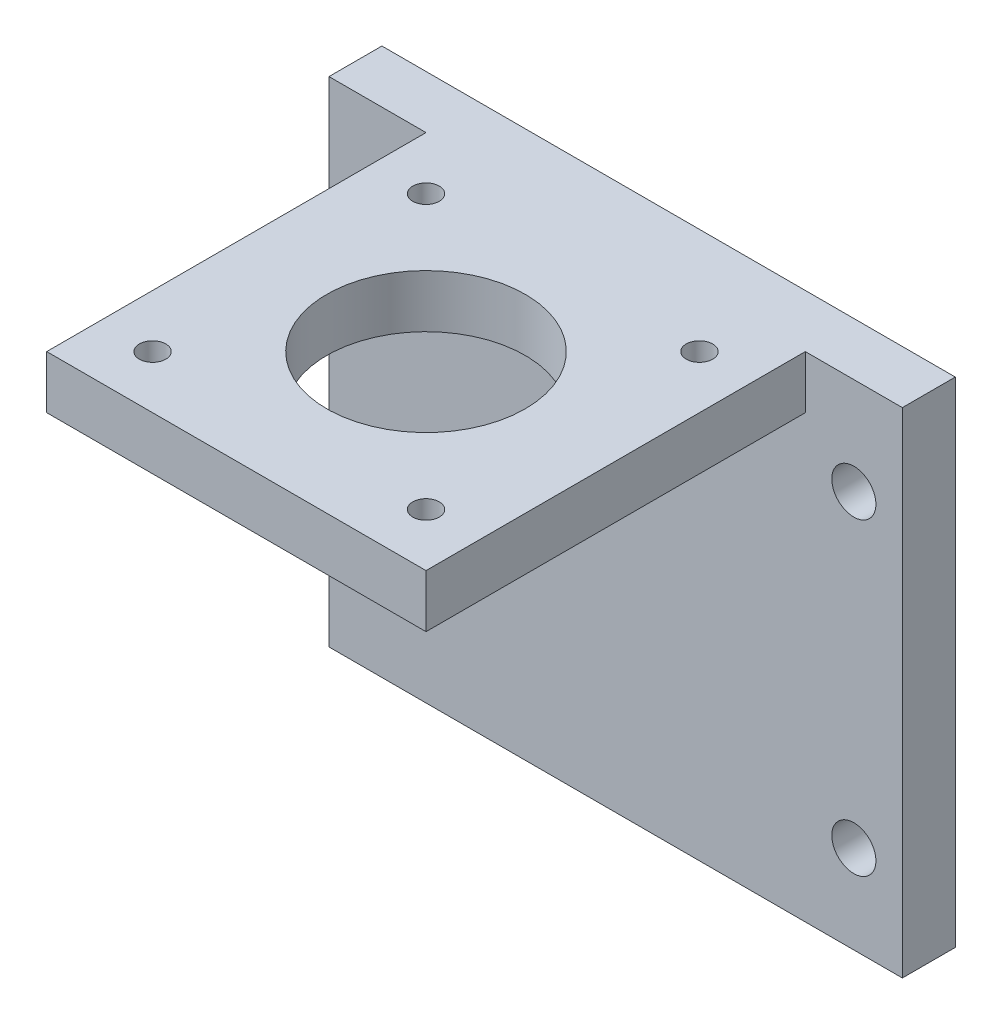
ISO-10303-21;
HEADER;
FILE_DESCRIPTION(('STEP AP214'),'2;1');
FILE_NAME('part.step','',(''),(''),'','','');
FILE_SCHEMA(('AUTOMOTIVE_DESIGN { 1 0 10303 214 1 1 1 1 }'));
ENDSEC;
DATA;
#1=APPLICATION_CONTEXT('core data for automotive mechanical design processes');
#2=APPLICATION_PROTOCOL_DEFINITION('international standard','automotive_design',2000,#1);
#3=PRODUCT_CONTEXT('',#1,'mechanical');
#4=PRODUCT('Part','Part','',(#3));
#5=PRODUCT_RELATED_PRODUCT_CATEGORY('part','',(#4));
#6=PRODUCT_DEFINITION_FORMATION('','',#4);
#7=PRODUCT_DEFINITION_CONTEXT('part definition',#1,'design');
#8=PRODUCT_DEFINITION('design','',#6,#7);
#9=PRODUCT_DEFINITION_SHAPE('','',#8);
#10=(LENGTH_UNIT() NAMED_UNIT(*) SI_UNIT(.MILLI.,.METRE.));
#11=(NAMED_UNIT(*) PLANE_ANGLE_UNIT() SI_UNIT($,.RADIAN.));
#12=(NAMED_UNIT(*) SI_UNIT($,.STERADIAN.) SOLID_ANGLE_UNIT());
#13=UNCERTAINTY_MEASURE_WITH_UNIT(LENGTH_MEASURE(1.E-05),#10,'distance_accuracy_value','');
#14=(GEOMETRIC_REPRESENTATION_CONTEXT(3) GLOBAL_UNCERTAINTY_ASSIGNED_CONTEXT((#13)) GLOBAL_UNIT_ASSIGNED_CONTEXT((#10,
#11,#12)) REPRESENTATION_CONTEXT('',''));
#15=CARTESIAN_POINT('',(0.,0.,0.));
#16=DIRECTION('',(0.,0.,1.));
#17=DIRECTION('',(1.,0.,0.));
#18=AXIS2_PLACEMENT_3D('',#15,#16,#17);
#19=CARTESIAN_POINT('',(48.,-6.,12.));
#20=DIRECTION('',(0.,-1.,0.));
#21=DIRECTION('',(0.,0.,-1.));
#22=AXIS2_PLACEMENT_3D('',#19,#20,#21);
#23=PLANE('',#22);
#24=CARTESIAN_POINT('',(48.,-6.,12.));
#25=DIRECTION('',(0.,-1.,0.));
#26=DIRECTION('',(1.,0.,0.));
#27=AXIS2_PLACEMENT_3D('',#24,#25,#26);
#28=CIRCLE('',#27,1.5);
#29=CARTESIAN_POINT('',(49.5,-6.,12.));
#30=VERTEX_POINT('',#29);
#31=EDGE_CURVE('E145',#30,#30,#28,.T.);
#32=ORIENTED_EDGE('',*,*,#31,.F.);
#33=EDGE_LOOP('',(#32));
#34=FACE_BOUND('',#33,.T.);
#35=CARTESIAN_POINT('',(17.,-6.,43.));
#36=DIRECTION('',(0.,-1.,0.));
#37=DIRECTION('',(1.,0.,0.));
#38=AXIS2_PLACEMENT_3D('',#35,#36,#37);
#39=CIRCLE('',#38,1.5);
#40=CARTESIAN_POINT('',(18.5,-6.,43.));
#41=VERTEX_POINT('',#40);
#42=EDGE_CURVE('E149',#41,#41,#39,.T.);
#43=ORIENTED_EDGE('',*,*,#42,.F.);
#44=EDGE_LOOP('',(#43));
#45=FACE_BOUND('',#44,.T.);
#46=CARTESIAN_POINT('',(17.,-6.,12.));
#47=DIRECTION('',(0.,-1.,0.));
#48=DIRECTION('',(1.,0.,0.));
#49=AXIS2_PLACEMENT_3D('',#46,#47,#48);
#50=CIRCLE('',#49,1.5);
#51=CARTESIAN_POINT('',(18.5,-6.,12.));
#52=VERTEX_POINT('',#51);
#53=EDGE_CURVE('E153',#52,#52,#50,.T.);
#54=ORIENTED_EDGE('',*,*,#53,.F.);
#55=EDGE_LOOP('',(#54));
#56=FACE_BOUND('',#55,.T.);
#57=CARTESIAN_POINT('',(32.5,-6.,27.5));
#58=DIRECTION('',(0.,-1.,0.));
#59=DIRECTION('',(1.,0.,0.));
#60=AXIS2_PLACEMENT_3D('',#57,#58,#59);
#61=CIRCLE('',#60,11.25);
#62=CARTESIAN_POINT('',(43.75,-6.,27.5));
#63=VERTEX_POINT('',#62);
#64=EDGE_CURVE('E157',#63,#63,#61,.T.);
#65=ORIENTED_EDGE('',*,*,#64,.F.);
#66=EDGE_LOOP('',(#65));
#67=FACE_BOUND('',#66,.T.);
#68=CARTESIAN_POINT('',(48.,-6.,43.));
#69=DIRECTION('',(0.,-1.,0.));
#70=DIRECTION('',(1.,0.,0.));
#71=AXIS2_PLACEMENT_3D('',#68,#69,#70);
#72=CIRCLE('',#71,1.5);
#73=CARTESIAN_POINT('',(49.5,-6.,43.));
#74=VERTEX_POINT('',#73);
#75=EDGE_CURVE('E104',#74,#74,#72,.T.);
#76=ORIENTED_EDGE('',*,*,#75,.F.);
#77=EDGE_LOOP('',(#76));
#78=FACE_BOUND('',#77,.T.);
#79=DIRECTION('',(0.,0.,-1.));
#80=VECTOR('',#79,1.);
#81=CARTESIAN_POINT('',(11.,-6.,49.));
#82=LINE('',#81,#80);
#83=CARTESIAN_POINT('',(11.,-6.,49.));
#84=VERTEX_POINT('',#83);
#85=CARTESIAN_POINT('',(11.,-6.,6.));
#86=VERTEX_POINT('',#85);
#87=EDGE_CURVE('E142',#84,#86,#82,.T.);
#88=ORIENTED_EDGE('',*,*,#87,.T.);
#89=DIRECTION('',(1.,0.,0.));
#90=VECTOR('',#89,1.);
#91=CARTESIAN_POINT('',(48.,-6.,6.));
#92=LINE('',#91,#90);
#93=CARTESIAN_POINT('',(54.,-6.,6.));
#94=VERTEX_POINT('',#93);
#95=EDGE_CURVE('E10',#86,#94,#92,.T.);
#96=ORIENTED_EDGE('',*,*,#95,.T.);
#97=DIRECTION('',(0.,0.,1.));
#98=VECTOR('',#97,1.);
#99=CARTESIAN_POINT('',(54.,-6.,6.));
#100=LINE('',#99,#98);
#101=CARTESIAN_POINT('',(54.,-6.,49.));
#102=VERTEX_POINT('',#101);
#103=EDGE_CURVE('E136',#94,#102,#100,.T.);
#104=ORIENTED_EDGE('',*,*,#103,.T.);
#105=DIRECTION('',(-1.,0.,0.));
#106=VECTOR('',#105,1.);
#107=CARTESIAN_POINT('',(54.,-6.,49.));
#108=LINE('',#107,#106);
#109=EDGE_CURVE('E36',#102,#84,#108,.T.);
#110=ORIENTED_EDGE('',*,*,#109,.T.);
#111=EDGE_LOOP('',(#88,#96,#104,#110));
#112=FACE_BOUND('',#111,.T.);
#113=ADVANCED_FACE('F16',(#34,#45,#56,#67,#78,#112),#23,.T.);
#114=CARTESIAN_POINT('',(0.,-6.,6.));
#115=DIRECTION('',(1.,0.,0.));
#116=DIRECTION('',(0.,0.,-1.));
#117=AXIS2_PLACEMENT_3D('',#114,#115,#116);
#118=PLANE('',#117);
#119=DIRECTION('',(0.,0.,-1.));
#120=VECTOR('',#119,1.);
#121=CARTESIAN_POINT('',(0.,0.,6.));
#122=LINE('',#121,#120);
#123=CARTESIAN_POINT('',(0.,0.,6.));
#124=VERTEX_POINT('',#123);
#125=CARTESIAN_POINT('',(0.,0.,0.));
#126=VERTEX_POINT('',#125);
#127=EDGE_CURVE('E115',#124,#126,#122,.T.);
#128=ORIENTED_EDGE('',*,*,#127,.T.);
#129=DIRECTION('',(0.,1.,0.));
#130=VECTOR('',#129,1.);
#131=CARTESIAN_POINT('',(0.,-6.,0.));
#132=LINE('',#131,#130);
#133=CARTESIAN_POINT('',(0.,-56.,0.));
#134=VERTEX_POINT('',#133);
#135=EDGE_CURVE('E27',#134,#126,#132,.T.);
#136=ORIENTED_EDGE('',*,*,#135,.F.);
#137=DIRECTION('',(0.,0.,-1.));
#138=VECTOR('',#137,1.);
#139=CARTESIAN_POINT('',(0.,-56.,6.));
#140=LINE('',#139,#138);
#141=CARTESIAN_POINT('',(0.,-56.,6.));
#142=VERTEX_POINT('',#141);
#143=EDGE_CURVE('E111',#142,#134,#140,.T.);
#144=ORIENTED_EDGE('',*,*,#143,.F.);
#145=DIRECTION('',(0.,1.,0.));
#146=VECTOR('',#145,1.);
#147=CARTESIAN_POINT('',(0.,-6.,6.));
#148=LINE('',#147,#146);
#149=EDGE_CURVE('E91',#142,#124,#148,.T.);
#150=ORIENTED_EDGE('',*,*,#149,.T.);
#151=EDGE_LOOP('',(#128,#136,#144,#150));
#152=FACE_BOUND('',#151,.T.);
#153=ADVANCED_FACE('F18',(#152),#118,.F.);
#154=CARTESIAN_POINT('',(0.,-6.,0.));
#155=DIRECTION('',(0.,0.,1.));
#156=DIRECTION('',(1.,0.,0.));
#157=AXIS2_PLACEMENT_3D('',#154,#155,#156);
#158=PLANE('',#157);
#159=CARTESIAN_POINT('',(59.5,-46.,0.));
#160=DIRECTION('',(0.,0.,1.));
#161=DIRECTION('',(1.,0.,0.));
#162=AXIS2_PLACEMENT_3D('',#159,#160,#161);
#163=CIRCLE('',#162,2.5);
#164=CARTESIAN_POINT('',(62.,-46.,0.));
#165=VERTEX_POINT('',#164);
#166=EDGE_CURVE('E20',#165,#165,#163,.F.);
#167=ORIENTED_EDGE('',*,*,#166,.F.);
#168=EDGE_LOOP('',(#167));
#169=FACE_BOUND('',#168,.T.);
#170=CARTESIAN_POINT('',(5.5,-11.,0.));
#171=DIRECTION('',(0.,0.,1.));
#172=DIRECTION('',(1.,0.,0.));
#173=AXIS2_PLACEMENT_3D('',#170,#171,#172);
#174=CIRCLE('',#173,2.5);
#175=CARTESIAN_POINT('',(8.,-11.,0.));
#176=VERTEX_POINT('',#175);
#177=EDGE_CURVE('E129',#176,#176,#174,.F.);
#178=ORIENTED_EDGE('',*,*,#177,.F.);
#179=EDGE_LOOP('',(#178));
#180=FACE_BOUND('',#179,.T.);
#181=CARTESIAN_POINT('',(5.5,-46.,0.));
#182=DIRECTION('',(0.,0.,1.));
#183=DIRECTION('',(1.,0.,0.));
#184=AXIS2_PLACEMENT_3D('',#181,#182,#183);
#185=CIRCLE('',#184,2.5);
#186=CARTESIAN_POINT('',(8.,-46.,0.));
#187=VERTEX_POINT('',#186);
#188=EDGE_CURVE('E228',#187,#187,#185,.F.);
#189=ORIENTED_EDGE('',*,*,#188,.F.);
#190=EDGE_LOOP('',(#189));
#191=FACE_BOUND('',#190,.T.);
#192=CARTESIAN_POINT('',(59.5,-11.,0.));
#193=DIRECTION('',(0.,0.,1.));
#194=DIRECTION('',(1.,0.,0.));
#195=AXIS2_PLACEMENT_3D('',#192,#193,#194);
#196=CIRCLE('',#195,2.5);
#197=CARTESIAN_POINT('',(62.,-11.,0.));
#198=VERTEX_POINT('',#197);
#199=EDGE_CURVE('E224',#198,#198,#196,.F.);
#200=ORIENTED_EDGE('',*,*,#199,.F.);
#201=EDGE_LOOP('',(#200));
#202=FACE_BOUND('',#201,.T.);
#203=DIRECTION('',(1.,0.,0.));
#204=VECTOR('',#203,1.);
#205=CARTESIAN_POINT('',(0.,0.,0.));
#206=LINE('',#205,#204);
#207=CARTESIAN_POINT('',(65.,0.,0.));
#208=VERTEX_POINT('',#207);
#209=EDGE_CURVE('E166',#126,#208,#206,.T.);
#210=ORIENTED_EDGE('',*,*,#209,.T.);
#211=DIRECTION('',(0.,1.,0.));
#212=VECTOR('',#211,1.);
#213=CARTESIAN_POINT('',(65.,-6.,0.));
#214=LINE('',#213,#212);
#215=CARTESIAN_POINT('',(65.,-56.,0.));
#216=VERTEX_POINT('',#215);
#217=EDGE_CURVE('E218',#216,#208,#214,.T.);
#218=ORIENTED_EDGE('',*,*,#217,.F.);
#219=DIRECTION('',(1.,0.,0.));
#220=VECTOR('',#219,1.);
#221=CARTESIAN_POINT('',(0.,-56.,0.));
#222=LINE('',#221,#220);
#223=EDGE_CURVE('E120',#134,#216,#222,.T.);
#224=ORIENTED_EDGE('',*,*,#223,.F.);
#225=ORIENTED_EDGE('',*,*,#135,.T.);
#226=EDGE_LOOP('',(#210,#218,#224,#225));
#227=FACE_BOUND('',#226,.T.);
#228=ADVANCED_FACE('F239',(#169,#180,#191,#202,#227),#158,.F.);
#229=CARTESIAN_POINT('',(65.,-6.,0.));
#230=DIRECTION('',(-1.,0.,0.));
#231=DIRECTION('',(0.,0.,1.));
#232=AXIS2_PLACEMENT_3D('',#229,#230,#231);
#233=PLANE('',#232);
#234=DIRECTION('',(0.,0.,1.));
#235=VECTOR('',#234,1.);
#236=CARTESIAN_POINT('',(65.,0.,0.));
#237=LINE('',#236,#235);
#238=CARTESIAN_POINT('',(65.,0.,6.));
#239=VERTEX_POINT('',#238);
#240=EDGE_CURVE('E169',#208,#239,#237,.T.);
#241=ORIENTED_EDGE('',*,*,#240,.T.);
#242=DIRECTION('',(0.,1.,0.));
#243=VECTOR('',#242,1.);
#244=CARTESIAN_POINT('',(65.,-6.,6.));
#245=LINE('',#244,#243);
#246=CARTESIAN_POINT('',(65.,-56.,6.));
#247=VERTEX_POINT('',#246);
#248=EDGE_CURVE('E215',#247,#239,#245,.T.);
#249=ORIENTED_EDGE('',*,*,#248,.F.);
#250=DIRECTION('',(0.,0.,1.));
#251=VECTOR('',#250,1.);
#252=CARTESIAN_POINT('',(65.,-56.,0.));
#253=LINE('',#252,#251);
#254=EDGE_CURVE('E113',#216,#247,#253,.T.);
#255=ORIENTED_EDGE('',*,*,#254,.F.);
#256=ORIENTED_EDGE('',*,*,#217,.T.);
#257=EDGE_LOOP('',(#241,#249,#255,#256));
#258=FACE_BOUND('',#257,.T.);
#259=ADVANCED_FACE('F242',(#258),#233,.F.);
#260=CARTESIAN_POINT('',(54.,-6.,6.));
#261=DIRECTION('',(-1.,0.,0.));
#262=DIRECTION('',(0.,0.,1.));
#263=AXIS2_PLACEMENT_3D('',#260,#261,#262);
#264=PLANE('',#263);
#265=DIRECTION('',(0.,0.,1.));
#266=VECTOR('',#265,1.);
#267=CARTESIAN_POINT('',(54.,0.,6.));
#268=LINE('',#267,#266);
#269=CARTESIAN_POINT('',(54.,0.,6.));
#270=VERTEX_POINT('',#269);
#271=CARTESIAN_POINT('',(54.,0.,49.));
#272=VERTEX_POINT('',#271);
#273=EDGE_CURVE('E175',#270,#272,#268,.T.);
#274=ORIENTED_EDGE('',*,*,#273,.T.);
#275=DIRECTION('',(0.,1.,0.));
#276=VECTOR('',#275,1.);
#277=CARTESIAN_POINT('',(54.,-6.,49.));
#278=LINE('',#277,#276);
#279=EDGE_CURVE('E208',#102,#272,#278,.T.);
#280=ORIENTED_EDGE('',*,*,#279,.F.);
#281=ORIENTED_EDGE('',*,*,#103,.F.);
#282=DIRECTION('',(0.,1.,0.));
#283=VECTOR('',#282,1.);
#284=CARTESIAN_POINT('',(54.,-6.,6.));
#285=LINE('',#284,#283);
#286=EDGE_CURVE('E211',#94,#270,#285,.T.);
#287=ORIENTED_EDGE('',*,*,#286,.T.);
#288=EDGE_LOOP('',(#274,#280,#281,#287));
#289=FACE_BOUND('',#288,.T.);
#290=ADVANCED_FACE('F257',(#289),#264,.F.);
#291=CARTESIAN_POINT('',(54.,-6.,49.));
#292=DIRECTION('',(0.,0.,-1.));
#293=DIRECTION('',(-1.,0.,0.));
#294=AXIS2_PLACEMENT_3D('',#291,#292,#293);
#295=PLANE('',#294);
#296=DIRECTION('',(-1.,0.,0.));
#297=VECTOR('',#296,1.);
#298=CARTESIAN_POINT('',(54.,0.,49.));
#299=LINE('',#298,#297);
#300=CARTESIAN_POINT('',(11.,0.,49.));
#301=VERTEX_POINT('',#300);
#302=EDGE_CURVE('E65',#272,#301,#299,.T.);
#303=ORIENTED_EDGE('',*,*,#302,.T.);
#304=DIRECTION('',(0.,1.,0.));
#305=VECTOR('',#304,1.);
#306=CARTESIAN_POINT('',(11.,-6.,49.));
#307=LINE('',#306,#305);
#308=EDGE_CURVE('E205',#84,#301,#307,.T.);
#309=ORIENTED_EDGE('',*,*,#308,.F.);
#310=ORIENTED_EDGE('',*,*,#109,.F.);
#311=ORIENTED_EDGE('',*,*,#279,.T.);
#312=EDGE_LOOP('',(#303,#309,#310,#311));
#313=FACE_BOUND('',#312,.T.);
#314=ADVANCED_FACE('F300',(#313),#295,.F.);
#315=CARTESIAN_POINT('',(11.,-6.,49.));
#316=DIRECTION('',(1.,0.,0.));
#317=DIRECTION('',(0.,0.,-1.));
#318=AXIS2_PLACEMENT_3D('',#315,#316,#317);
#319=PLANE('',#318);
#320=DIRECTION('',(0.,0.,-1.));
#321=VECTOR('',#320,1.);
#322=CARTESIAN_POINT('',(11.,0.,49.));
#323=LINE('',#322,#321);
#324=CARTESIAN_POINT('',(11.,0.,6.));
#325=VERTEX_POINT('',#324);
#326=EDGE_CURVE('E71',#301,#325,#323,.T.);
#327=ORIENTED_EDGE('',*,*,#326,.T.);
#328=DIRECTION('',(0.,1.,0.));
#329=VECTOR('',#328,1.);
#330=CARTESIAN_POINT('',(11.,-6.,6.));
#331=LINE('',#330,#329);
#332=EDGE_CURVE('E103',#86,#325,#331,.T.);
#333=ORIENTED_EDGE('',*,*,#332,.F.);
#334=ORIENTED_EDGE('',*,*,#87,.F.);
#335=ORIENTED_EDGE('',*,*,#308,.T.);
#336=EDGE_LOOP('',(#327,#333,#334,#335));
#337=FACE_BOUND('',#336,.T.);
#338=ADVANCED_FACE('F282',(#337),#319,.F.);
#339=CARTESIAN_POINT('',(32.5,-6.,27.5));
#340=DIRECTION('',(0.,1.,0.));
#341=DIRECTION('',(0.,0.,1.));
#342=AXIS2_PLACEMENT_3D('',#339,#340,#341);
#343=CYLINDRICAL_SURFACE('',#342,11.25);
#344=ORIENTED_EDGE('',*,*,#64,.T.);
#345=EDGE_LOOP('',(#344));
#346=FACE_BOUND('',#345,.T.);
#347=CARTESIAN_POINT('',(32.5,0.,27.5));
#348=DIRECTION('',(0.,-1.,0.));
#349=DIRECTION('',(1.,0.,0.));
#350=AXIS2_PLACEMENT_3D('',#347,#348,#349);
#351=CIRCLE('',#350,11.25);
#352=CARTESIAN_POINT('',(43.75,0.,27.5));
#353=VERTEX_POINT('',#352);
#354=EDGE_CURVE('E196',#353,#353,#351,.T.);
#355=ORIENTED_EDGE('',*,*,#354,.F.);
#356=EDGE_LOOP('',(#355));
#357=FACE_BOUND('',#356,.T.);
#358=ADVANCED_FACE('F278',(#346,#357),#343,.F.);
#359=CARTESIAN_POINT('',(17.,-6.,12.));
#360=DIRECTION('',(0.,1.,0.));
#361=DIRECTION('',(0.,0.,1.));
#362=AXIS2_PLACEMENT_3D('',#359,#360,#361);
#363=CYLINDRICAL_SURFACE('',#362,1.5);
#364=ORIENTED_EDGE('',*,*,#53,.T.);
#365=EDGE_LOOP('',(#364));
#366=FACE_BOUND('',#365,.T.);
#367=CARTESIAN_POINT('',(17.,0.,12.));
#368=DIRECTION('',(0.,-1.,0.));
#369=DIRECTION('',(1.,0.,0.));
#370=AXIS2_PLACEMENT_3D('',#367,#368,#369);
#371=CIRCLE('',#370,1.5);
#372=CARTESIAN_POINT('',(18.5,0.,12.));
#373=VERTEX_POINT('',#372);
#374=EDGE_CURVE('E192',#373,#373,#371,.T.);
#375=ORIENTED_EDGE('',*,*,#374,.F.);
#376=EDGE_LOOP('',(#375));
#377=FACE_BOUND('',#376,.T.);
#378=ADVANCED_FACE('F281',(#366,#377),#363,.F.);
#379=CARTESIAN_POINT('',(17.,-6.,43.));
#380=DIRECTION('',(0.,1.,0.));
#381=DIRECTION('',(0.,0.,1.));
#382=AXIS2_PLACEMENT_3D('',#379,#380,#381);
#383=CYLINDRICAL_SURFACE('',#382,1.5);
#384=ORIENTED_EDGE('',*,*,#42,.T.);
#385=EDGE_LOOP('',(#384));
#386=FACE_BOUND('',#385,.T.);
#387=CARTESIAN_POINT('',(17.,0.,43.));
#388=DIRECTION('',(0.,-1.,0.));
#389=DIRECTION('',(1.,0.,0.));
#390=AXIS2_PLACEMENT_3D('',#387,#388,#389);
#391=CIRCLE('',#390,1.5);
#392=CARTESIAN_POINT('',(18.5,0.,43.));
#393=VERTEX_POINT('',#392);
#394=EDGE_CURVE('E188',#393,#393,#391,.T.);
#395=ORIENTED_EDGE('',*,*,#394,.F.);
#396=EDGE_LOOP('',(#395));
#397=FACE_BOUND('',#396,.T.);
#398=ADVANCED_FACE('F286',(#386,#397),#383,.F.);
#399=CARTESIAN_POINT('',(48.,-6.,12.));
#400=DIRECTION('',(0.,1.,0.));
#401=DIRECTION('',(0.,0.,1.));
#402=AXIS2_PLACEMENT_3D('',#399,#400,#401);
#403=CYLINDRICAL_SURFACE('',#402,1.5);
#404=ORIENTED_EDGE('',*,*,#31,.T.);
#405=EDGE_LOOP('',(#404));
#406=FACE_BOUND('',#405,.T.);
#407=CARTESIAN_POINT('',(48.,0.,12.));
#408=DIRECTION('',(0.,-1.,0.));
#409=DIRECTION('',(1.,0.,0.));
#410=AXIS2_PLACEMENT_3D('',#407,#408,#409);
#411=CIRCLE('',#410,1.5);
#412=CARTESIAN_POINT('',(49.5,0.,12.));
#413=VERTEX_POINT('',#412);
#414=EDGE_CURVE('E184',#413,#413,#411,.T.);
#415=ORIENTED_EDGE('',*,*,#414,.F.);
#416=EDGE_LOOP('',(#415));
#417=FACE_BOUND('',#416,.T.);
#418=ADVANCED_FACE('F290',(#406,#417),#403,.F.);
#419=CARTESIAN_POINT('',(11.,-6.,6.));
#420=DIRECTION('',(0.,0.,-1.));
#421=DIRECTION('',(-1.,0.,0.));
#422=AXIS2_PLACEMENT_3D('',#419,#420,#421);
#423=PLANE('',#422);
#424=CARTESIAN_POINT('',(59.5,-46.,6.00000000000023));
#425=DIRECTION('',(0.,0.,1.));
#426=DIRECTION('',(-1.,0.,0.));
#427=AXIS2_PLACEMENT_3D('',#424,#425,#426);
#428=CIRCLE('',#427,2.5);
#429=CARTESIAN_POINT('',(57.,-46.,6.00000000000023));
#430=VERTEX_POINT('',#429);
#431=EDGE_CURVE('E686',#430,#430,#428,.T.);
#432=ORIENTED_EDGE('',*,*,#431,.F.);
#433=EDGE_LOOP('',(#432));
#434=FACE_BOUND('',#433,.T.);
#435=CARTESIAN_POINT('',(5.5,-11.,6.00000000000023));
#436=DIRECTION('',(0.,0.,1.));
#437=DIRECTION('',(-1.,0.,0.));
#438=AXIS2_PLACEMENT_3D('',#435,#436,#437);
#439=CIRCLE('',#438,2.5);
#440=CARTESIAN_POINT('',(3.,-11.,6.00000000000023));
#441=VERTEX_POINT('',#440);
#442=EDGE_CURVE('E675',#441,#441,#439,.T.);
#443=ORIENTED_EDGE('',*,*,#442,.F.);
#444=EDGE_LOOP('',(#443));
#445=FACE_BOUND('',#444,.T.);
#446=CARTESIAN_POINT('',(5.5,-46.,6.00000000000023));
#447=DIRECTION('',(0.,0.,1.));
#448=DIRECTION('',(-1.,0.,0.));
#449=AXIS2_PLACEMENT_3D('',#446,#447,#448);
#450=CIRCLE('',#449,2.5);
#451=CARTESIAN_POINT('',(3.,-46.,6.00000000000023));
#452=VERTEX_POINT('',#451);
#453=EDGE_CURVE('E670',#452,#452,#450,.T.);
#454=ORIENTED_EDGE('',*,*,#453,.F.);
#455=EDGE_LOOP('',(#454));
#456=FACE_BOUND('',#455,.T.);
#457=CARTESIAN_POINT('',(59.5,-11.,6.00000000000023));
#458=DIRECTION('',(0.,0.,1.));
#459=DIRECTION('',(-1.,0.,0.));
#460=AXIS2_PLACEMENT_3D('',#457,#458,#459);
#461=CIRCLE('',#460,2.5);
#462=CARTESIAN_POINT('',(57.,-11.,6.00000000000023));
#463=VERTEX_POINT('',#462);
#464=EDGE_CURVE('E131',#463,#463,#461,.T.);
#465=ORIENTED_EDGE('',*,*,#464,.F.);
#466=EDGE_LOOP('',(#465));
#467=FACE_BOUND('',#466,.T.);
#468=DIRECTION('',(-1.,0.,0.));
#469=VECTOR('',#468,1.);
#470=CARTESIAN_POINT('',(11.,0.,6.));
#471=LINE('',#470,#469);
#472=EDGE_CURVE('E97',#325,#124,#471,.T.);
#473=ORIENTED_EDGE('',*,*,#472,.T.);
#474=ORIENTED_EDGE('',*,*,#149,.F.);
#475=DIRECTION('',(-1.,0.,0.));
#476=VECTOR('',#475,1.);
#477=CARTESIAN_POINT('',(65.,-56.,6.));
#478=LINE('',#477,#476);
#479=EDGE_CURVE('E95',#247,#142,#478,.T.);
#480=ORIENTED_EDGE('',*,*,#479,.F.);
#481=ORIENTED_EDGE('',*,*,#248,.T.);
#482=DIRECTION('',(-1.,0.,0.));
#483=VECTOR('',#482,1.);
#484=CARTESIAN_POINT('',(65.,0.,6.));
#485=LINE('',#484,#483);
#486=EDGE_CURVE('E172',#239,#270,#485,.T.);
#487=ORIENTED_EDGE('',*,*,#486,.T.);
#488=ORIENTED_EDGE('',*,*,#286,.F.);
#489=ORIENTED_EDGE('',*,*,#95,.F.);
#490=ORIENTED_EDGE('',*,*,#332,.T.);
#491=EDGE_LOOP('',(#473,#474,#480,#481,#487,#488,#489,#490));
#492=FACE_BOUND('',#491,.T.);
#493=ADVANCED_FACE('F93',(#434,#445,#456,#467,#492),#423,.F.);
#494=CARTESIAN_POINT('',(48.,-6.,43.));
#495=DIRECTION('',(0.,1.,0.));
#496=DIRECTION('',(0.,0.,1.));
#497=AXIS2_PLACEMENT_3D('',#494,#495,#496);
#498=CYLINDRICAL_SURFACE('',#497,1.5);
#499=ORIENTED_EDGE('',*,*,#75,.T.);
#500=EDGE_LOOP('',(#499));
#501=FACE_BOUND('',#500,.T.);
#502=CARTESIAN_POINT('',(48.,0.,43.));
#503=DIRECTION('',(0.,-1.,0.));
#504=DIRECTION('',(1.,0.,0.));
#505=AXIS2_PLACEMENT_3D('',#502,#503,#504);
#506=CIRCLE('',#505,1.5);
#507=CARTESIAN_POINT('',(49.5,0.,43.));
#508=VERTEX_POINT('',#507);
#509=EDGE_CURVE('E139',#508,#508,#506,.T.);
#510=ORIENTED_EDGE('',*,*,#509,.F.);
#511=EDGE_LOOP('',(#510));
#512=FACE_BOUND('',#511,.T.);
#513=ADVANCED_FACE('F274',(#501,#512),#498,.F.);
#514=CARTESIAN_POINT('',(48.,0.,12.));
#515=DIRECTION('',(0.,-1.,0.));
#516=DIRECTION('',(0.,0.,-1.));
#517=AXIS2_PLACEMENT_3D('',#514,#515,#516);
#518=PLANE('',#517);
#519=ORIENTED_EDGE('',*,*,#273,.F.);
#520=ORIENTED_EDGE('',*,*,#486,.F.);
#521=ORIENTED_EDGE('',*,*,#240,.F.);
#522=ORIENTED_EDGE('',*,*,#209,.F.);
#523=ORIENTED_EDGE('',*,*,#127,.F.);
#524=ORIENTED_EDGE('',*,*,#472,.F.);
#525=ORIENTED_EDGE('',*,*,#326,.F.);
#526=ORIENTED_EDGE('',*,*,#302,.F.);
#527=EDGE_LOOP('',(#519,#520,#521,#522,#523,#524,#525,#526));
#528=FACE_BOUND('',#527,.T.);
#529=ORIENTED_EDGE('',*,*,#414,.T.);
#530=EDGE_LOOP('',(#529));
#531=FACE_BOUND('',#530,.T.);
#532=ORIENTED_EDGE('',*,*,#394,.T.);
#533=EDGE_LOOP('',(#532));
#534=FACE_BOUND('',#533,.T.);
#535=ORIENTED_EDGE('',*,*,#374,.T.);
#536=EDGE_LOOP('',(#535));
#537=FACE_BOUND('',#536,.T.);
#538=ORIENTED_EDGE('',*,*,#354,.T.);
#539=EDGE_LOOP('',(#538));
#540=FACE_BOUND('',#539,.T.);
#541=ORIENTED_EDGE('',*,*,#509,.T.);
#542=EDGE_LOOP('',(#541));
#543=FACE_BOUND('',#542,.T.);
#544=ADVANCED_FACE('F253',(#528,#531,#534,#537,#540,#543),#518,.F.);
#545=CARTESIAN_POINT('',(0.,-56.,0.));
#546=DIRECTION('',(0.,-1.,0.));
#547=DIRECTION('',(0.,0.,-1.));
#548=AXIS2_PLACEMENT_3D('',#545,#546,#547);
#549=PLANE('',#548);
#550=ORIENTED_EDGE('',*,*,#143,.T.);
#551=ORIENTED_EDGE('',*,*,#223,.T.);
#552=ORIENTED_EDGE('',*,*,#254,.T.);
#553=ORIENTED_EDGE('',*,*,#479,.T.);
#554=EDGE_LOOP('',(#550,#551,#552,#553));
#555=FACE_BOUND('',#554,.T.);
#556=ADVANCED_FACE('F109',(#555),#549,.T.);
#557=CARTESIAN_POINT('',(59.5,-11.,6.00000000000023));
#558=DIRECTION('',(0.,0.,-1.));
#559=DIRECTION('',(-1.,0.,0.));
#560=AXIS2_PLACEMENT_3D('',#557,#558,#559);
#561=CYLINDRICAL_SURFACE('',#560,2.5);
#562=ORIENTED_EDGE('',*,*,#464,.T.);
#563=EDGE_LOOP('',(#562));
#564=FACE_BOUND('',#563,.T.);
#565=ORIENTED_EDGE('',*,*,#199,.T.);
#566=EDGE_LOOP('',(#565));
#567=FACE_BOUND('',#566,.T.);
#568=ADVANCED_FACE('F370',(#564,#567),#561,.F.);
#569=CARTESIAN_POINT('',(5.5,-46.,6.00000000000023));
#570=DIRECTION('',(0.,0.,-1.));
#571=DIRECTION('',(-1.,0.,0.));
#572=AXIS2_PLACEMENT_3D('',#569,#570,#571);
#573=CYLINDRICAL_SURFACE('',#572,2.5);
#574=ORIENTED_EDGE('',*,*,#453,.T.);
#575=EDGE_LOOP('',(#574));
#576=FACE_BOUND('',#575,.T.);
#577=ORIENTED_EDGE('',*,*,#188,.T.);
#578=EDGE_LOOP('',(#577));
#579=FACE_BOUND('',#578,.T.);
#580=ADVANCED_FACE('F377',(#576,#579),#573,.F.);
#581=CARTESIAN_POINT('',(5.5,-11.,6.00000000000023));
#582=DIRECTION('',(0.,0.,-1.));
#583=DIRECTION('',(-1.,0.,0.));
#584=AXIS2_PLACEMENT_3D('',#581,#582,#583);
#585=CYLINDRICAL_SURFACE('',#584,2.5);
#586=ORIENTED_EDGE('',*,*,#442,.T.);
#587=EDGE_LOOP('',(#586));
#588=FACE_BOUND('',#587,.T.);
#589=ORIENTED_EDGE('',*,*,#177,.T.);
#590=EDGE_LOOP('',(#589));
#591=FACE_BOUND('',#590,.T.);
#592=ADVANCED_FACE('F237',(#588,#591),#585,.F.);
#593=CARTESIAN_POINT('',(59.5,-46.,6.00000000000023));
#594=DIRECTION('',(0.,0.,-1.));
#595=DIRECTION('',(-1.,0.,0.));
#596=AXIS2_PLACEMENT_3D('',#593,#594,#595);
#597=CYLINDRICAL_SURFACE('',#596,2.5);
#598=ORIENTED_EDGE('',*,*,#431,.T.);
#599=EDGE_LOOP('',(#598));
#600=FACE_BOUND('',#599,.T.);
#601=ORIENTED_EDGE('',*,*,#166,.T.);
#602=EDGE_LOOP('',(#601));
#603=FACE_BOUND('',#602,.T.);
#604=ADVANCED_FACE('F393',(#600,#603),#597,.F.);
#605=CLOSED_SHELL('',(#113,#153,#228,#259,#290,#314,#338,#358,#378,#398,#418,#493,#513,#544,
#556,#568,#580,#592,#604));
#606=MANIFOLD_SOLID_BREP('B1',#605);
#607=ADVANCED_BREP_SHAPE_REPRESENTATION('',(#18,#606),#14);
#608=SHAPE_DEFINITION_REPRESENTATION(#9,#607);
ENDSEC;
END-ISO-10303-21;
